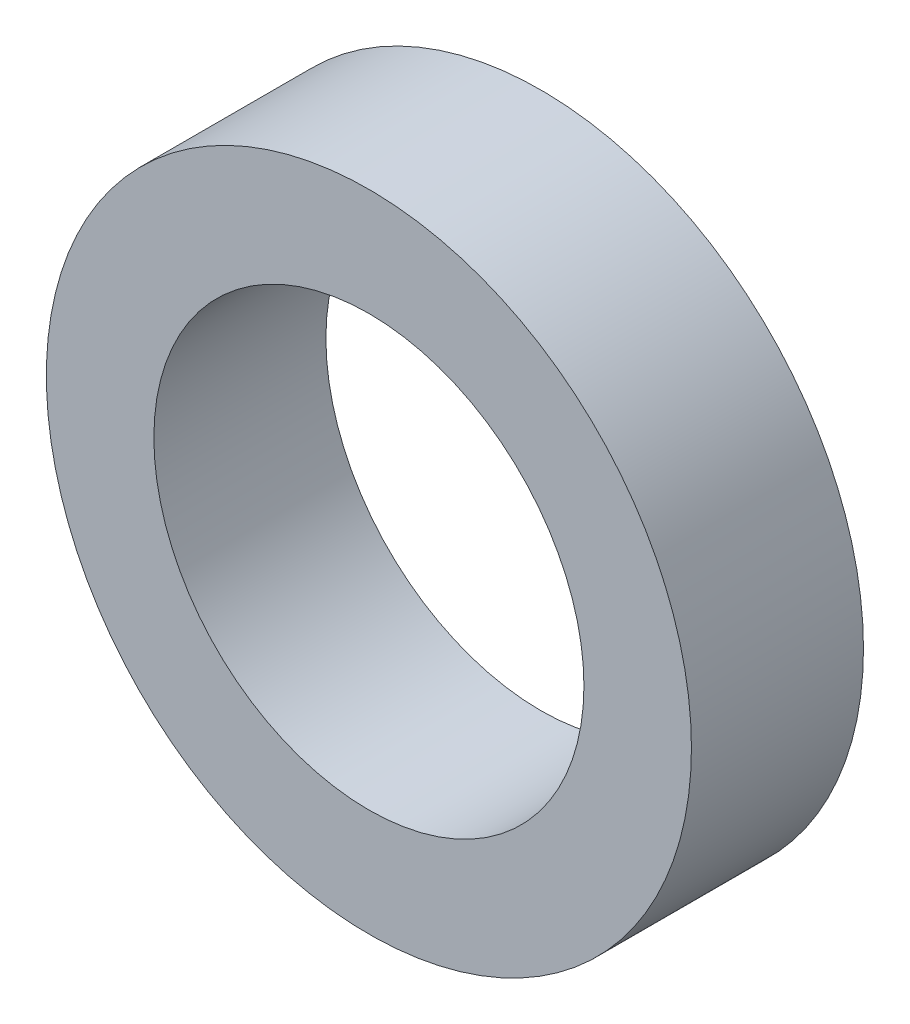
ISO-10303-21;
HEADER;
FILE_DESCRIPTION(('STEP AP214'),'2;1');
FILE_NAME('part.step','',(''),(''),'','','');
FILE_SCHEMA(('AUTOMOTIVE_DESIGN { 1 0 10303 214 1 1 1 1 }'));
ENDSEC;
DATA;
#1=APPLICATION_CONTEXT('core data for automotive mechanical design processes');
#2=APPLICATION_PROTOCOL_DEFINITION('international standard','automotive_design',2000,#1);
#3=PRODUCT_CONTEXT('',#1,'mechanical');
#4=PRODUCT('Part','Part','',(#3));
#5=PRODUCT_RELATED_PRODUCT_CATEGORY('part','',(#4));
#6=PRODUCT_DEFINITION_FORMATION('','',#4);
#7=PRODUCT_DEFINITION_CONTEXT('part definition',#1,'design');
#8=PRODUCT_DEFINITION('design','',#6,#7);
#9=PRODUCT_DEFINITION_SHAPE('','',#8);
#10=(LENGTH_UNIT() NAMED_UNIT(*) SI_UNIT(.MILLI.,.METRE.));
#11=(NAMED_UNIT(*) PLANE_ANGLE_UNIT() SI_UNIT($,.RADIAN.));
#12=(NAMED_UNIT(*) SI_UNIT($,.STERADIAN.) SOLID_ANGLE_UNIT());
#13=UNCERTAINTY_MEASURE_WITH_UNIT(LENGTH_MEASURE(1.E-05),#10,'distance_accuracy_value','');
#14=(GEOMETRIC_REPRESENTATION_CONTEXT(3) GLOBAL_UNCERTAINTY_ASSIGNED_CONTEXT((#13)) GLOBAL_UNIT_ASSIGNED_CONTEXT((#10,
#11,#12)) REPRESENTATION_CONTEXT('',''));
#15=CARTESIAN_POINT('',(0.,0.,0.));
#16=DIRECTION('',(0.,0.,1.));
#17=DIRECTION('',(1.,0.,0.));
#18=AXIS2_PLACEMENT_3D('',#15,#16,#17);
#19=CARTESIAN_POINT('',(0.,0.,2.));
#20=DIRECTION('',(0.,0.,1.));
#21=DIRECTION('',(1.,0.,0.));
#22=AXIS2_PLACEMENT_3D('',#19,#20,#21);
#23=PLANE('',#22);
#24=CARTESIAN_POINT('',(0.,0.,2.));
#25=DIRECTION('',(0.,0.,1.));
#26=DIRECTION('',(1.,0.,0.));
#27=AXIS2_PLACEMENT_3D('',#24,#25,#26);
#28=CIRCLE('',#27,7.5);
#29=CARTESIAN_POINT('',(7.5,0.,2.));
#30=VERTEX_POINT('',#29);
#31=EDGE_CURVE('E10',#30,#30,#28,.T.);
#32=ORIENTED_EDGE('',*,*,#31,.T.);
#33=EDGE_LOOP('',(#32));
#34=FACE_BOUND('',#33,.T.);
#35=CARTESIAN_POINT('',(0.,0.,2.));
#36=DIRECTION('',(0.,0.,1.));
#37=DIRECTION('',(1.,0.,0.));
#38=AXIS2_PLACEMENT_3D('',#35,#36,#37);
#39=CIRCLE('',#38,5.);
#40=CARTESIAN_POINT('',(5.,0.,2.));
#41=VERTEX_POINT('',#40);
#42=EDGE_CURVE('E42',#41,#41,#39,.T.);
#43=ORIENTED_EDGE('',*,*,#42,.F.);
#44=EDGE_LOOP('',(#43));
#45=FACE_BOUND('',#44,.T.);
#46=ADVANCED_FACE('F31',(#34,#45),#23,.T.);
#47=CARTESIAN_POINT('',(0.,0.,-2.));
#48=DIRECTION('',(0.,0.,1.));
#49=DIRECTION('',(1.,0.,0.));
#50=AXIS2_PLACEMENT_3D('',#47,#48,#49);
#51=PLANE('',#50);
#52=CARTESIAN_POINT('',(0.,0.,-2.));
#53=DIRECTION('',(0.,0.,1.));
#54=DIRECTION('',(1.,0.,0.));
#55=AXIS2_PLACEMENT_3D('',#52,#53,#54);
#56=CIRCLE('',#55,7.5);
#57=CARTESIAN_POINT('',(7.5,0.,-2.));
#58=VERTEX_POINT('',#57);
#59=EDGE_CURVE('E35',#58,#58,#56,.T.);
#60=ORIENTED_EDGE('',*,*,#59,.F.);
#61=EDGE_LOOP('',(#60));
#62=FACE_BOUND('',#61,.T.);
#63=CARTESIAN_POINT('',(0.,0.,-2.));
#64=DIRECTION('',(0.,0.,1.));
#65=DIRECTION('',(1.,0.,0.));
#66=AXIS2_PLACEMENT_3D('',#63,#64,#65);
#67=CIRCLE('',#66,5.);
#68=CARTESIAN_POINT('',(5.,0.,-2.));
#69=VERTEX_POINT('',#68);
#70=EDGE_CURVE('E44',#69,#69,#67,.T.);
#71=ORIENTED_EDGE('',*,*,#70,.T.);
#72=EDGE_LOOP('',(#71));
#73=FACE_BOUND('',#72,.T.);
#74=ADVANCED_FACE('F54',(#62,#73),#51,.F.);
#75=CARTESIAN_POINT('',(0.,0.,2.));
#76=DIRECTION('',(0.,0.,-1.));
#77=DIRECTION('',(-1.,0.,0.));
#78=AXIS2_PLACEMENT_3D('',#75,#76,#77);
#79=CYLINDRICAL_SURFACE('',#78,7.5);
#80=ORIENTED_EDGE('',*,*,#31,.F.);
#81=EDGE_LOOP('',(#80));
#82=FACE_BOUND('',#81,.T.);
#83=ORIENTED_EDGE('',*,*,#59,.T.);
#84=EDGE_LOOP('',(#83));
#85=FACE_BOUND('',#84,.T.);
#86=ADVANCED_FACE('F33',(#82,#85),#79,.T.);
#87=CARTESIAN_POINT('',(0.,0.,2.));
#88=DIRECTION('',(0.,0.,-1.));
#89=DIRECTION('',(-1.,0.,0.));
#90=AXIS2_PLACEMENT_3D('',#87,#88,#89);
#91=CYLINDRICAL_SURFACE('',#90,5.);
#92=ORIENTED_EDGE('',*,*,#42,.T.);
#93=EDGE_LOOP('',(#92));
#94=FACE_BOUND('',#93,.T.);
#95=ORIENTED_EDGE('',*,*,#70,.F.);
#96=EDGE_LOOP('',(#95));
#97=FACE_BOUND('',#96,.T.);
#98=ADVANCED_FACE('F50',(#94,#97),#91,.F.);
#99=CLOSED_SHELL('',(#46,#74,#86,#98));
#100=MANIFOLD_SOLID_BREP('B2',#99);
#101=ADVANCED_BREP_SHAPE_REPRESENTATION('',(#18,#100),#14);
#102=SHAPE_DEFINITION_REPRESENTATION(#9,#101);
ENDSEC;
END-ISO-10303-21;
